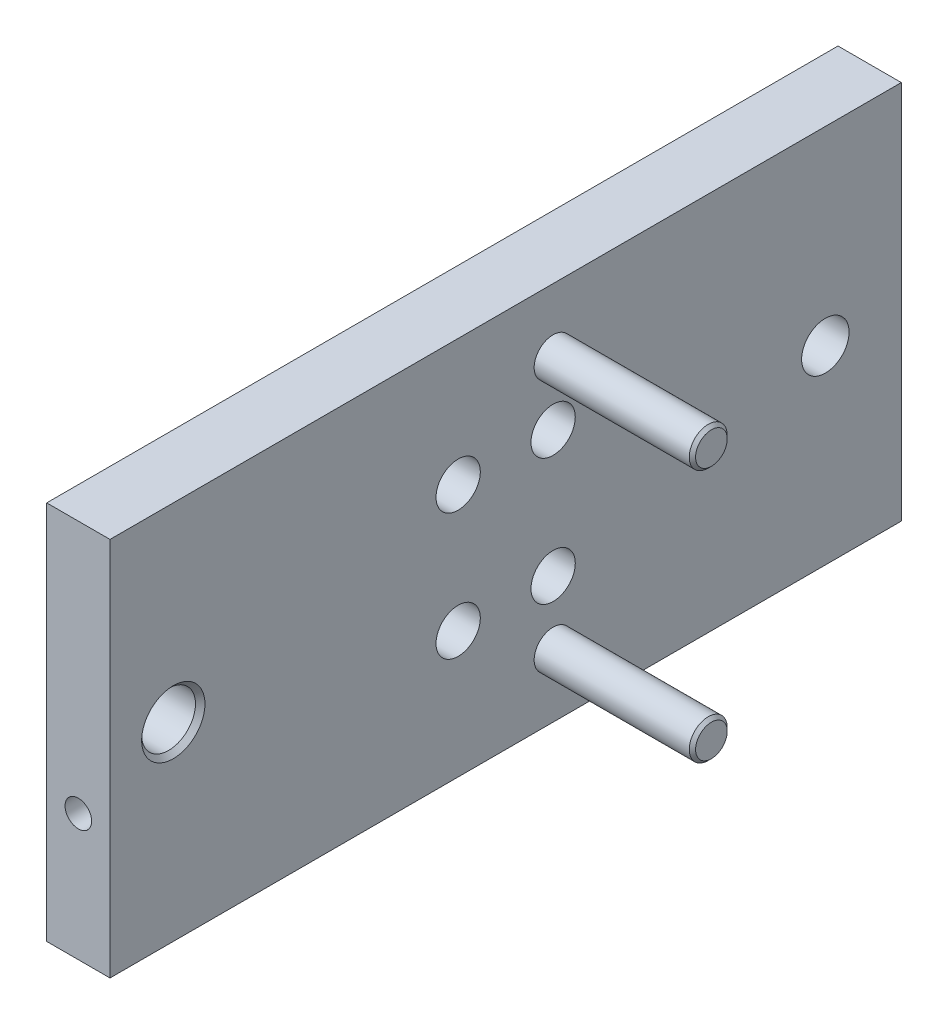
ISO-10303-21;
HEADER;
FILE_DESCRIPTION(('STEP AP214'),'2;1');
FILE_NAME('part.step','',(''),(''),'','','');
FILE_SCHEMA(('AUTOMOTIVE_DESIGN { 1 0 10303 214 1 1 1 1 }'));
ENDSEC;
DATA;
#1=APPLICATION_CONTEXT('core data for automotive mechanical design processes');
#2=APPLICATION_PROTOCOL_DEFINITION('international standard','automotive_design',2000,#1);
#3=PRODUCT_CONTEXT('',#1,'mechanical');
#4=PRODUCT('Part','Part','',(#3));
#5=PRODUCT_RELATED_PRODUCT_CATEGORY('part','',(#4));
#6=PRODUCT_DEFINITION_FORMATION('','',#4);
#7=PRODUCT_DEFINITION_CONTEXT('part definition',#1,'design');
#8=PRODUCT_DEFINITION('design','',#6,#7);
#9=PRODUCT_DEFINITION_SHAPE('','',#8);
#10=(LENGTH_UNIT() NAMED_UNIT(*) SI_UNIT(.MILLI.,.METRE.));
#11=(NAMED_UNIT(*) PLANE_ANGLE_UNIT() SI_UNIT($,.RADIAN.));
#12=(NAMED_UNIT(*) SI_UNIT($,.STERADIAN.) SOLID_ANGLE_UNIT());
#13=UNCERTAINTY_MEASURE_WITH_UNIT(LENGTH_MEASURE(1.E-05),#10,'distance_accuracy_value','');
#14=(GEOMETRIC_REPRESENTATION_CONTEXT(3) GLOBAL_UNCERTAINTY_ASSIGNED_CONTEXT((#13)) GLOBAL_UNIT_ASSIGNED_CONTEXT((#10,
#11,#12)) REPRESENTATION_CONTEXT('',''));
#15=CARTESIAN_POINT('',(0.,0.,0.));
#16=DIRECTION('',(0.,0.,1.));
#17=DIRECTION('',(1.,0.,0.));
#18=AXIS2_PLACEMENT_3D('',#15,#16,#17);
#19=CARTESIAN_POINT('',(10.,60.,0.));
#20=DIRECTION('',(1.,0.,0.));
#21=DIRECTION('',(0.,0.,-1.));
#22=AXIS2_PLACEMENT_3D('',#19,#20,#21);
#23=PLANE('',#22);
#24=CARTESIAN_POINT('',(10.,20.,70.));
#25=DIRECTION('',(1.,0.,0.));
#26=DIRECTION('',(0.,0.,-1.));
#27=AXIS2_PLACEMENT_3D('',#24,#25,#26);
#28=CIRCLE('',#27,3.5);
#29=CARTESIAN_POINT('',(10.,20.,66.5));
#30=VERTEX_POINT('',#29);
#31=EDGE_CURVE('E99',#30,#30,#28,.T.);
#32=ORIENTED_EDGE('',*,*,#31,.F.);
#33=EDGE_LOOP('',(#32));
#34=FACE_BOUND('',#33,.T.);
#35=CARTESIAN_POINT('',(10.,20.,55.));
#36=DIRECTION('',(1.,0.,0.));
#37=DIRECTION('',(0.,0.,-1.));
#38=AXIS2_PLACEMENT_3D('',#35,#36,#37);
#39=CIRCLE('',#38,3.5);
#40=CARTESIAN_POINT('',(10.,20.,51.5));
#41=VERTEX_POINT('',#40);
#42=EDGE_CURVE('E116',#41,#41,#39,.T.);
#43=ORIENTED_EDGE('',*,*,#42,.F.);
#44=EDGE_LOOP('',(#43));
#45=FACE_BOUND('',#44,.T.);
#46=CARTESIAN_POINT('',(10.,40.,55.));
#47=DIRECTION('',(1.,0.,0.));
#48=DIRECTION('',(0.,0.,-1.));
#49=AXIS2_PLACEMENT_3D('',#46,#47,#48);
#50=CIRCLE('',#49,3.5);
#51=CARTESIAN_POINT('',(10.,40.,51.5));
#52=VERTEX_POINT('',#51);
#53=EDGE_CURVE('E128',#52,#52,#50,.T.);
#54=ORIENTED_EDGE('',*,*,#53,.F.);
#55=EDGE_LOOP('',(#54));
#56=FACE_BOUND('',#55,.T.);
#57=CARTESIAN_POINT('',(10.,40.,70.));
#58=DIRECTION('',(1.,0.,0.));
#59=DIRECTION('',(0.,0.,-1.));
#60=AXIS2_PLACEMENT_3D('',#57,#58,#59);
#61=CIRCLE('',#60,3.5);
#62=CARTESIAN_POINT('',(10.,40.,66.5));
#63=VERTEX_POINT('',#62);
#64=EDGE_CURVE('E140',#63,#63,#61,.T.);
#65=ORIENTED_EDGE('',*,*,#64,.F.);
#66=EDGE_LOOP('',(#65));
#67=FACE_BOUND('',#66,.T.);
#68=CARTESIAN_POINT('',(10.,30.,12.));
#69=DIRECTION('',(1.,0.,0.));
#70=DIRECTION('',(0.,0.,-1.));
#71=AXIS2_PLACEMENT_3D('',#68,#69,#70);
#72=CIRCLE('',#71,3.75);
#73=CARTESIAN_POINT('',(10.,30.,8.25));
#74=VERTEX_POINT('',#73);
#75=EDGE_CURVE('E152',#74,#74,#72,.T.);
#76=ORIENTED_EDGE('',*,*,#75,.F.);
#77=EDGE_LOOP('',(#76));
#78=FACE_BOUND('',#77,.T.);
#79=CARTESIAN_POINT('',(10.,30.,115.));
#80=DIRECTION('',(1.,0.,0.));
#81=DIRECTION('',(0.,0.,-1.));
#82=AXIS2_PLACEMENT_3D('',#79,#80,#81);
#83=CIRCLE('',#82,5.);
#84=CARTESIAN_POINT('',(10.,30.,110.));
#85=VERTEX_POINT('',#84);
#86=EDGE_CURVE('E156',#85,#85,#83,.T.);
#87=ORIENTED_EDGE('',*,*,#86,.F.);
#88=EDGE_LOOP('',(#87));
#89=FACE_BOUND('',#88,.T.);
#90=CARTESIAN_POINT('',(10.,9.99999999999999,55.));
#91=DIRECTION('',(1.,0.,0.));
#92=DIRECTION('',(0.,0.,-1.));
#93=AXIS2_PLACEMENT_3D('',#90,#91,#92);
#94=CIRCLE('',#93,3.);
#95=CARTESIAN_POINT('',(10.,9.99999999999999,52.));
#96=VERTEX_POINT('',#95);
#97=EDGE_CURVE('E168',#96,#96,#94,.T.);
#98=ORIENTED_EDGE('',*,*,#97,.F.);
#99=EDGE_LOOP('',(#98));
#100=FACE_BOUND('',#99,.T.);
#101=DIRECTION('',(0.,1.,0.));
#102=VECTOR('',#101,1.);
#103=CARTESIAN_POINT('',(10.,0.,0.));
#104=LINE('',#103,#102);
#105=CARTESIAN_POINT('',(10.,0.,0.));
#106=VERTEX_POINT('',#105);
#107=CARTESIAN_POINT('',(10.,60.,0.));
#108=VERTEX_POINT('',#107);
#109=EDGE_CURVE('E172',#106,#108,#104,.T.);
#110=ORIENTED_EDGE('',*,*,#109,.T.);
#111=DIRECTION('',(0.,0.,1.));
#112=VECTOR('',#111,1.);
#113=CARTESIAN_POINT('',(10.,60.,0.));
#114=LINE('',#113,#112);
#115=CARTESIAN_POINT('',(10.,60.,125.));
#116=VERTEX_POINT('',#115);
#117=EDGE_CURVE('E85',#108,#116,#114,.T.);
#118=ORIENTED_EDGE('',*,*,#117,.T.);
#119=DIRECTION('',(0.,-1.,0.));
#120=VECTOR('',#119,1.);
#121=CARTESIAN_POINT('',(10.,0.,125.));
#122=LINE('',#121,#120);
#123=CARTESIAN_POINT('',(10.,0.,125.));
#124=VERTEX_POINT('',#123);
#125=EDGE_CURVE('E175',#116,#124,#122,.T.);
#126=ORIENTED_EDGE('',*,*,#125,.T.);
#127=DIRECTION('',(0.,0.,-1.));
#128=VECTOR('',#127,1.);
#129=CARTESIAN_POINT('',(10.,0.,0.));
#130=LINE('',#129,#128);
#131=EDGE_CURVE('E53',#124,#106,#130,.T.);
#132=ORIENTED_EDGE('',*,*,#131,.T.);
#133=EDGE_LOOP('',(#110,#118,#126,#132));
#134=FACE_BOUND('',#133,.T.);
#135=CARTESIAN_POINT('',(10.,50.,55.));
#136=DIRECTION('',(1.,0.,0.));
#137=DIRECTION('',(0.,0.,-1.));
#138=AXIS2_PLACEMENT_3D('',#135,#136,#137);
#139=CIRCLE('',#138,3.);
#140=CARTESIAN_POINT('',(10.,50.,52.));
#141=VERTEX_POINT('',#140);
#142=EDGE_CURVE('E165',#141,#141,#139,.T.);
#143=ORIENTED_EDGE('',*,*,#142,.F.);
#144=EDGE_LOOP('',(#143));
#145=FACE_BOUND('',#144,.T.);
#146=ADVANCED_FACE('F36',(#34,#45,#56,#67,#78,#89,#100,#134,#145),#23,.T.);
#147=CARTESIAN_POINT('',(10.,0.,0.));
#148=DIRECTION('',(0.,0.,1.));
#149=DIRECTION('',(1.,0.,0.));
#150=AXIS2_PLACEMENT_3D('',#147,#148,#149);
#151=PLANE('',#150);
#152=DIRECTION('',(0.,1.,0.));
#153=VECTOR('',#152,1.);
#154=CARTESIAN_POINT('',(0.,0.,0.));
#155=LINE('',#154,#153);
#156=CARTESIAN_POINT('',(0.,0.,0.));
#157=VERTEX_POINT('',#156);
#158=CARTESIAN_POINT('',(0.,60.,0.));
#159=VERTEX_POINT('',#158);
#160=EDGE_CURVE('E171',#157,#159,#155,.T.);
#161=ORIENTED_EDGE('',*,*,#160,.T.);
#162=DIRECTION('',(-1.,0.,0.));
#163=VECTOR('',#162,1.);
#164=CARTESIAN_POINT('',(10.,60.,0.));
#165=LINE('',#164,#163);
#166=EDGE_CURVE('E190',#108,#159,#165,.T.);
#167=ORIENTED_EDGE('',*,*,#166,.F.);
#168=ORIENTED_EDGE('',*,*,#109,.F.);
#169=DIRECTION('',(-1.,0.,0.));
#170=VECTOR('',#169,1.);
#171=CARTESIAN_POINT('',(10.,0.,0.));
#172=LINE('',#171,#170);
#173=EDGE_CURVE('E178',#106,#157,#172,.T.);
#174=ORIENTED_EDGE('',*,*,#173,.T.);
#175=EDGE_LOOP('',(#161,#167,#168,#174));
#176=FACE_BOUND('',#175,.T.);
#177=ADVANCED_FACE('F213',(#176),#151,.F.);
#178=CARTESIAN_POINT('',(10.,60.,0.));
#179=DIRECTION('',(0.,-1.,0.));
#180=DIRECTION('',(0.,0.,-1.));
#181=AXIS2_PLACEMENT_3D('',#178,#179,#180);
#182=PLANE('',#181);
#183=DIRECTION('',(0.,0.,1.));
#184=VECTOR('',#183,1.);
#185=CARTESIAN_POINT('',(0.,60.,0.));
#186=LINE('',#185,#184);
#187=CARTESIAN_POINT('',(0.,60.,125.));
#188=VERTEX_POINT('',#187);
#189=EDGE_CURVE('E181',#159,#188,#186,.T.);
#190=ORIENTED_EDGE('',*,*,#189,.T.);
#191=DIRECTION('',(-1.,0.,0.));
#192=VECTOR('',#191,1.);
#193=CARTESIAN_POINT('',(10.,60.,125.));
#194=LINE('',#193,#192);
#195=EDGE_CURVE('E188',#116,#188,#194,.T.);
#196=ORIENTED_EDGE('',*,*,#195,.F.);
#197=ORIENTED_EDGE('',*,*,#117,.F.);
#198=ORIENTED_EDGE('',*,*,#166,.T.);
#199=EDGE_LOOP('',(#190,#196,#197,#198));
#200=FACE_BOUND('',#199,.T.);
#201=ADVANCED_FACE('F219',(#200),#182,.F.);
#202=CARTESIAN_POINT('',(10.,0.,125.));
#203=DIRECTION('',(0.,0.,-1.));
#204=DIRECTION('',(-1.,0.,0.));
#205=AXIS2_PLACEMENT_3D('',#202,#203,#204);
#206=PLANE('',#205);
#207=CARTESIAN_POINT('',(5.,20.,125.));
#208=DIRECTION('',(0.,0.,1.));
#209=DIRECTION('',(1.,0.,0.));
#210=AXIS2_PLACEMENT_3D('',#207,#208,#209);
#211=CIRCLE('',#210,2.09999999999999);
#212=CARTESIAN_POINT('',(7.09999999999999,20.,125.));
#213=VERTEX_POINT('',#212);
#214=EDGE_CURVE('E100',#213,#213,#211,.T.);
#215=ORIENTED_EDGE('',*,*,#214,.F.);
#216=EDGE_LOOP('',(#215));
#217=FACE_BOUND('',#216,.T.);
#218=DIRECTION('',(0.,-1.,0.));
#219=VECTOR('',#218,1.);
#220=CARTESIAN_POINT('',(0.,0.,125.));
#221=LINE('',#220,#219);
#222=CARTESIAN_POINT('',(0.,0.,125.));
#223=VERTEX_POINT('',#222);
#224=EDGE_CURVE('E71',#188,#223,#221,.T.);
#225=ORIENTED_EDGE('',*,*,#224,.T.);
#226=DIRECTION('',(-1.,0.,0.));
#227=VECTOR('',#226,1.);
#228=CARTESIAN_POINT('',(10.,0.,125.));
#229=LINE('',#228,#227);
#230=EDGE_CURVE('E186',#124,#223,#229,.T.);
#231=ORIENTED_EDGE('',*,*,#230,.F.);
#232=ORIENTED_EDGE('',*,*,#125,.F.);
#233=ORIENTED_EDGE('',*,*,#195,.T.);
#234=EDGE_LOOP('',(#225,#231,#232,#233));
#235=FACE_BOUND('',#234,.T.);
#236=ADVANCED_FACE('F235',(#217,#235),#206,.F.);
#237=CARTESIAN_POINT('',(10.,0.,0.));
#238=DIRECTION('',(0.,1.,0.));
#239=DIRECTION('',(0.,0.,1.));
#240=AXIS2_PLACEMENT_3D('',#237,#238,#239);
#241=PLANE('',#240);
#242=DIRECTION('',(0.,0.,-1.));
#243=VECTOR('',#242,1.);
#244=CARTESIAN_POINT('',(0.,0.,0.));
#245=LINE('',#244,#243);
#246=EDGE_CURVE('E77',#223,#157,#245,.T.);
#247=ORIENTED_EDGE('',*,*,#246,.T.);
#248=ORIENTED_EDGE('',*,*,#173,.F.);
#249=ORIENTED_EDGE('',*,*,#131,.F.);
#250=ORIENTED_EDGE('',*,*,#230,.T.);
#251=EDGE_LOOP('',(#247,#248,#249,#250));
#252=FACE_BOUND('',#251,.T.);
#253=ADVANCED_FACE('F231',(#252),#241,.F.);
#254=CARTESIAN_POINT('',(0.,60.,0.));
#255=DIRECTION('',(1.,0.,0.));
#256=DIRECTION('',(0.,0.,-1.));
#257=AXIS2_PLACEMENT_3D('',#254,#255,#256);
#258=PLANE('',#257);
#259=CARTESIAN_POINT('',(0.,20.,70.));
#260=DIRECTION('',(1.,0.,0.));
#261=DIRECTION('',(0.,0.,-1.));
#262=AXIS2_PLACEMENT_3D('',#259,#260,#261);
#263=CIRCLE('',#262,1.7);
#264=CARTESIAN_POINT('',(0.,20.,68.3));
#265=VERTEX_POINT('',#264);
#266=EDGE_CURVE('E113',#265,#265,#263,.T.);
#267=ORIENTED_EDGE('',*,*,#266,.T.);
#268=EDGE_LOOP('',(#267));
#269=FACE_BOUND('',#268,.T.);
#270=CARTESIAN_POINT('',(0.,20.,55.));
#271=DIRECTION('',(1.,0.,0.));
#272=DIRECTION('',(0.,0.,-1.));
#273=AXIS2_PLACEMENT_3D('',#270,#271,#272);
#274=CIRCLE('',#273,1.7);
#275=CARTESIAN_POINT('',(0.,20.,53.3));
#276=VERTEX_POINT('',#275);
#277=EDGE_CURVE('E125',#276,#276,#274,.T.);
#278=ORIENTED_EDGE('',*,*,#277,.T.);
#279=EDGE_LOOP('',(#278));
#280=FACE_BOUND('',#279,.T.);
#281=CARTESIAN_POINT('',(0.,40.,55.));
#282=DIRECTION('',(1.,0.,0.));
#283=DIRECTION('',(0.,0.,-1.));
#284=AXIS2_PLACEMENT_3D('',#281,#282,#283);
#285=CIRCLE('',#284,1.7);
#286=CARTESIAN_POINT('',(0.,40.,53.3));
#287=VERTEX_POINT('',#286);
#288=EDGE_CURVE('E137',#287,#287,#285,.T.);
#289=ORIENTED_EDGE('',*,*,#288,.T.);
#290=EDGE_LOOP('',(#289));
#291=FACE_BOUND('',#290,.T.);
#292=CARTESIAN_POINT('',(0.,40.,70.));
#293=DIRECTION('',(1.,0.,0.));
#294=DIRECTION('',(0.,0.,-1.));
#295=AXIS2_PLACEMENT_3D('',#292,#293,#294);
#296=CIRCLE('',#295,1.7);
#297=CARTESIAN_POINT('',(0.,40.,68.3));
#298=VERTEX_POINT('',#297);
#299=EDGE_CURVE('E149',#298,#298,#296,.T.);
#300=ORIENTED_EDGE('',*,*,#299,.T.);
#301=EDGE_LOOP('',(#300));
#302=FACE_BOUND('',#301,.T.);
#303=CARTESIAN_POINT('',(0.,30.,12.));
#304=DIRECTION('',(1.,0.,0.));
#305=DIRECTION('',(0.,0.,-1.));
#306=AXIS2_PLACEMENT_3D('',#303,#304,#305);
#307=CIRCLE('',#306,3.75);
#308=CARTESIAN_POINT('',(0.,30.,8.25));
#309=VERTEX_POINT('',#308);
#310=EDGE_CURVE('E153',#309,#309,#307,.T.);
#311=ORIENTED_EDGE('',*,*,#310,.T.);
#312=EDGE_LOOP('',(#311));
#313=FACE_BOUND('',#312,.T.);
#314=CARTESIAN_POINT('',(0.,30.,115.));
#315=DIRECTION('',(1.,0.,0.));
#316=DIRECTION('',(0.,0.,-1.));
#317=AXIS2_PLACEMENT_3D('',#314,#315,#316);
#318=CIRCLE('',#317,4.24999999999999);
#319=CARTESIAN_POINT('',(0.,30.,110.75));
#320=VERTEX_POINT('',#319);
#321=EDGE_CURVE('E164',#320,#320,#318,.T.);
#322=ORIENTED_EDGE('',*,*,#321,.T.);
#323=EDGE_LOOP('',(#322));
#324=FACE_BOUND('',#323,.T.);
#325=ORIENTED_EDGE('',*,*,#160,.F.);
#326=ORIENTED_EDGE('',*,*,#246,.F.);
#327=ORIENTED_EDGE('',*,*,#224,.F.);
#328=ORIENTED_EDGE('',*,*,#189,.F.);
#329=EDGE_LOOP('',(#325,#326,#327,#328));
#330=FACE_BOUND('',#329,.T.);
#331=ADVANCED_FACE('F228',(#269,#280,#291,#302,#313,#324,#330),#258,.F.);
#332=CARTESIAN_POINT('',(35.,9.99999999999999,55.));
#333=DIRECTION('',(-1.,0.,0.));
#334=DIRECTION('',(0.,0.,1.));
#335=AXIS2_PLACEMENT_3D('',#332,#333,#334);
#336=CYLINDRICAL_SURFACE('',#335,3.);
#337=CARTESIAN_POINT('',(34.5,9.99999999999999,55.));
#338=DIRECTION('',(1.,0.,0.));
#339=DIRECTION('',(0.,0.,-1.));
#340=AXIS2_PLACEMENT_3D('',#337,#338,#339);
#341=CIRCLE('',#340,3.);
#342=CARTESIAN_POINT('',(34.5,9.99999999999999,52.));
#343=VERTEX_POINT('',#342);
#344=EDGE_CURVE('E11',#343,#343,#341,.F.);
#345=ORIENTED_EDGE('',*,*,#344,.T.);
#346=EDGE_LOOP('',(#345));
#347=FACE_BOUND('',#346,.T.);
#348=ORIENTED_EDGE('',*,*,#97,.T.);
#349=EDGE_LOOP('',(#348));
#350=FACE_BOUND('',#349,.T.);
#351=ADVANCED_FACE('F226',(#347,#350),#336,.T.);
#352=CARTESIAN_POINT('',(35.,9.99999999999999,55.));
#353=DIRECTION('',(1.,0.,0.));
#354=DIRECTION('',(0.,0.,-1.));
#355=AXIS2_PLACEMENT_3D('',#352,#353,#354);
#356=PLANE('',#355);
#357=CARTESIAN_POINT('',(35.,9.99999999999999,55.));
#358=DIRECTION('',(1.,0.,0.));
#359=DIRECTION('',(0.,0.,-1.));
#360=AXIS2_PLACEMENT_3D('',#357,#358,#359);
#361=CIRCLE('',#360,2.50000000000002);
#362=CARTESIAN_POINT('',(35.,9.99999999999999,52.5));
#363=VERTEX_POINT('',#362);
#364=EDGE_CURVE('E45',#363,#363,#361,.T.);
#365=ORIENTED_EDGE('',*,*,#364,.T.);
#366=EDGE_LOOP('',(#365));
#367=FACE_BOUND('',#366,.T.);
#368=ADVANCED_FACE('F202',(#367),#356,.T.);
#369=CARTESIAN_POINT('',(35.,50.,55.));
#370=DIRECTION('',(-1.,0.,0.));
#371=DIRECTION('',(0.,0.,1.));
#372=AXIS2_PLACEMENT_3D('',#369,#370,#371);
#373=CYLINDRICAL_SURFACE('',#372,3.);
#374=CARTESIAN_POINT('',(34.5,50.,55.));
#375=DIRECTION('',(1.,0.,0.));
#376=DIRECTION('',(0.,0.,-1.));
#377=AXIS2_PLACEMENT_3D('',#374,#375,#376);
#378=CIRCLE('',#377,3.);
#379=CARTESIAN_POINT('',(34.5,50.,52.));
#380=VERTEX_POINT('',#379);
#381=EDGE_CURVE('E197',#380,#380,#378,.F.);
#382=ORIENTED_EDGE('',*,*,#381,.T.);
#383=EDGE_LOOP('',(#382));
#384=FACE_BOUND('',#383,.T.);
#385=ORIENTED_EDGE('',*,*,#142,.T.);
#386=EDGE_LOOP('',(#385));
#387=FACE_BOUND('',#386,.T.);
#388=ADVANCED_FACE('F250',(#384,#387),#373,.T.);
#389=CARTESIAN_POINT('',(35.,50.,55.));
#390=DIRECTION('',(1.,0.,0.));
#391=DIRECTION('',(0.,0.,-1.));
#392=AXIS2_PLACEMENT_3D('',#389,#390,#391);
#393=PLANE('',#392);
#394=CARTESIAN_POINT('',(35.,50.,55.));
#395=DIRECTION('',(1.,0.,0.));
#396=DIRECTION('',(0.,0.,-1.));
#397=AXIS2_PLACEMENT_3D('',#394,#395,#396);
#398=CIRCLE('',#397,2.50000000000002);
#399=CARTESIAN_POINT('',(35.,50.,52.5));
#400=VERTEX_POINT('',#399);
#401=EDGE_CURVE('E192',#400,#400,#398,.T.);
#402=ORIENTED_EDGE('',*,*,#401,.T.);
#403=EDGE_LOOP('',(#402));
#404=FACE_BOUND('',#403,.T.);
#405=ADVANCED_FACE('F252',(#404),#393,.T.);
#406=CARTESIAN_POINT('',(10.,30.,115.));
#407=DIRECTION('',(1.,0.,0.));
#408=DIRECTION('',(0.,0.,-1.));
#409=AXIS2_PLACEMENT_3D('',#406,#407,#408);
#410=CYLINDRICAL_SURFACE('',#409,4.24999999999999);
#411=CARTESIAN_POINT('',(9.25,30.,115.));
#412=DIRECTION('',(1.,0.,0.));
#413=DIRECTION('',(0.,0.,-1.));
#414=AXIS2_PLACEMENT_3D('',#411,#412,#413);
#415=CIRCLE('',#414,4.25);
#416=CARTESIAN_POINT('',(9.25,30.,110.75));
#417=VERTEX_POINT('',#416);
#418=EDGE_CURVE('E161',#417,#417,#415,.T.);
#419=ORIENTED_EDGE('',*,*,#418,.T.);
#420=EDGE_LOOP('',(#419));
#421=FACE_BOUND('',#420,.T.);
#422=ORIENTED_EDGE('',*,*,#321,.F.);
#423=EDGE_LOOP('',(#422));
#424=FACE_BOUND('',#423,.T.);
#425=ADVANCED_FACE('F259',(#421,#424),#410,.F.);
#426=CARTESIAN_POINT('',(10.,30.,115.));
#427=DIRECTION('',(1.,0.,0.));
#428=DIRECTION('',(0.,0.,-1.));
#429=AXIS2_PLACEMENT_3D('',#426,#427,#428);
#430=CONICAL_SURFACE('',#429,5.,0.785398163397448);
#431=ORIENTED_EDGE('',*,*,#418,.F.);
#432=EDGE_LOOP('',(#431));
#433=FACE_BOUND('',#432,.T.);
#434=ORIENTED_EDGE('',*,*,#86,.T.);
#435=EDGE_LOOP('',(#434));
#436=FACE_BOUND('',#435,.T.);
#437=ADVANCED_FACE('F265',(#433,#436),#430,.F.);
#438=CARTESIAN_POINT('',(0.,30.,12.));
#439=DIRECTION('',(1.,0.,0.));
#440=DIRECTION('',(0.,0.,-1.));
#441=AXIS2_PLACEMENT_3D('',#438,#439,#440);
#442=CYLINDRICAL_SURFACE('',#441,3.75);
#443=ORIENTED_EDGE('',*,*,#310,.F.);
#444=EDGE_LOOP('',(#443));
#445=FACE_BOUND('',#444,.T.);
#446=ORIENTED_EDGE('',*,*,#75,.T.);
#447=EDGE_LOOP('',(#446));
#448=FACE_BOUND('',#447,.T.);
#449=ADVANCED_FACE('F269',(#445,#448),#442,.F.);
#450=CARTESIAN_POINT('',(10.,40.,70.));
#451=DIRECTION('',(1.,0.,0.));
#452=DIRECTION('',(0.,0.,-1.));
#453=AXIS2_PLACEMENT_3D('',#450,#451,#452);
#454=CYLINDRICAL_SURFACE('',#453,1.7);
#455=ORIENTED_EDGE('',*,*,#299,.F.);
#456=EDGE_LOOP('',(#455));
#457=FACE_BOUND('',#456,.T.);
#458=CARTESIAN_POINT('',(5.,40.,70.));
#459=DIRECTION('',(1.,0.,0.));
#460=DIRECTION('',(0.,0.,-1.));
#461=AXIS2_PLACEMENT_3D('',#458,#459,#460);
#462=CIRCLE('',#461,1.7);
#463=CARTESIAN_POINT('',(5.,40.,68.3));
#464=VERTEX_POINT('',#463);
#465=EDGE_CURVE('E146',#464,#464,#462,.T.);
#466=ORIENTED_EDGE('',*,*,#465,.T.);
#467=EDGE_LOOP('',(#466));
#468=FACE_BOUND('',#467,.T.);
#469=ADVANCED_FACE('F273',(#457,#468),#454,.F.);
#470=CARTESIAN_POINT('',(5.,41.7,70.));
#471=DIRECTION('',(-1.,0.,0.));
#472=DIRECTION('',(0.,0.,1.));
#473=AXIS2_PLACEMENT_3D('',#470,#471,#472);
#474=PLANE('',#473);
#475=ORIENTED_EDGE('',*,*,#465,.F.);
#476=EDGE_LOOP('',(#475));
#477=FACE_BOUND('',#476,.T.);
#478=CARTESIAN_POINT('',(5.,40.,70.));
#479=DIRECTION('',(1.,0.,0.));
#480=DIRECTION('',(0.,0.,-1.));
#481=AXIS2_PLACEMENT_3D('',#478,#479,#480);
#482=CIRCLE('',#481,3.5);
#483=CARTESIAN_POINT('',(5.,40.,66.5));
#484=VERTEX_POINT('',#483);
#485=EDGE_CURVE('E143',#484,#484,#482,.T.);
#486=ORIENTED_EDGE('',*,*,#485,.T.);
#487=EDGE_LOOP('',(#486));
#488=FACE_BOUND('',#487,.T.);
#489=ADVANCED_FACE('F277',(#477,#488),#474,.F.);
#490=CARTESIAN_POINT('',(10.,40.,70.));
#491=DIRECTION('',(1.,0.,0.));
#492=DIRECTION('',(0.,0.,-1.));
#493=AXIS2_PLACEMENT_3D('',#490,#491,#492);
#494=CYLINDRICAL_SURFACE('',#493,3.5);
#495=ORIENTED_EDGE('',*,*,#485,.F.);
#496=EDGE_LOOP('',(#495));
#497=FACE_BOUND('',#496,.T.);
#498=ORIENTED_EDGE('',*,*,#64,.T.);
#499=EDGE_LOOP('',(#498));
#500=FACE_BOUND('',#499,.T.);
#501=ADVANCED_FACE('F281',(#497,#500),#494,.F.);
#502=CARTESIAN_POINT('',(10.,40.,55.));
#503=DIRECTION('',(1.,0.,0.));
#504=DIRECTION('',(0.,0.,-1.));
#505=AXIS2_PLACEMENT_3D('',#502,#503,#504);
#506=CYLINDRICAL_SURFACE('',#505,1.7);
#507=ORIENTED_EDGE('',*,*,#288,.F.);
#508=EDGE_LOOP('',(#507));
#509=FACE_BOUND('',#508,.T.);
#510=CARTESIAN_POINT('',(5.,40.,55.));
#511=DIRECTION('',(1.,0.,0.));
#512=DIRECTION('',(0.,0.,-1.));
#513=AXIS2_PLACEMENT_3D('',#510,#511,#512);
#514=CIRCLE('',#513,1.7);
#515=CARTESIAN_POINT('',(5.,40.,53.3));
#516=VERTEX_POINT('',#515);
#517=EDGE_CURVE('E134',#516,#516,#514,.T.);
#518=ORIENTED_EDGE('',*,*,#517,.T.);
#519=EDGE_LOOP('',(#518));
#520=FACE_BOUND('',#519,.T.);
#521=ADVANCED_FACE('F285',(#509,#520),#506,.F.);
#522=CARTESIAN_POINT('',(5.,41.7,55.));
#523=DIRECTION('',(-1.,0.,0.));
#524=DIRECTION('',(0.,0.,1.));
#525=AXIS2_PLACEMENT_3D('',#522,#523,#524);
#526=PLANE('',#525);
#527=ORIENTED_EDGE('',*,*,#517,.F.);
#528=EDGE_LOOP('',(#527));
#529=FACE_BOUND('',#528,.T.);
#530=CARTESIAN_POINT('',(5.,40.,55.));
#531=DIRECTION('',(1.,0.,0.));
#532=DIRECTION('',(0.,0.,-1.));
#533=AXIS2_PLACEMENT_3D('',#530,#531,#532);
#534=CIRCLE('',#533,3.5);
#535=CARTESIAN_POINT('',(5.,40.,51.5));
#536=VERTEX_POINT('',#535);
#537=EDGE_CURVE('E131',#536,#536,#534,.T.);
#538=ORIENTED_EDGE('',*,*,#537,.T.);
#539=EDGE_LOOP('',(#538));
#540=FACE_BOUND('',#539,.T.);
#541=ADVANCED_FACE('F289',(#529,#540),#526,.F.);
#542=CARTESIAN_POINT('',(10.,40.,55.));
#543=DIRECTION('',(1.,0.,0.));
#544=DIRECTION('',(0.,0.,-1.));
#545=AXIS2_PLACEMENT_3D('',#542,#543,#544);
#546=CYLINDRICAL_SURFACE('',#545,3.5);
#547=ORIENTED_EDGE('',*,*,#537,.F.);
#548=EDGE_LOOP('',(#547));
#549=FACE_BOUND('',#548,.T.);
#550=ORIENTED_EDGE('',*,*,#53,.T.);
#551=EDGE_LOOP('',(#550));
#552=FACE_BOUND('',#551,.T.);
#553=ADVANCED_FACE('F293',(#549,#552),#546,.F.);
#554=CARTESIAN_POINT('',(10.,20.,55.));
#555=DIRECTION('',(1.,0.,0.));
#556=DIRECTION('',(0.,0.,-1.));
#557=AXIS2_PLACEMENT_3D('',#554,#555,#556);
#558=CYLINDRICAL_SURFACE('',#557,1.7);
#559=ORIENTED_EDGE('',*,*,#277,.F.);
#560=EDGE_LOOP('',(#559));
#561=FACE_BOUND('',#560,.T.);
#562=CARTESIAN_POINT('',(5.,20.,55.));
#563=DIRECTION('',(1.,0.,0.));
#564=DIRECTION('',(0.,0.,-1.));
#565=AXIS2_PLACEMENT_3D('',#562,#563,#564);
#566=CIRCLE('',#565,1.7);
#567=CARTESIAN_POINT('',(5.,20.,53.3));
#568=VERTEX_POINT('',#567);
#569=EDGE_CURVE('E122',#568,#568,#566,.T.);
#570=ORIENTED_EDGE('',*,*,#569,.T.);
#571=EDGE_LOOP('',(#570));
#572=FACE_BOUND('',#571,.T.);
#573=ADVANCED_FACE('F297',(#561,#572),#558,.F.);
#574=CARTESIAN_POINT('',(5.,21.7,55.));
#575=DIRECTION('',(-1.,0.,0.));
#576=DIRECTION('',(0.,0.,1.));
#577=AXIS2_PLACEMENT_3D('',#574,#575,#576);
#578=PLANE('',#577);
#579=ORIENTED_EDGE('',*,*,#569,.F.);
#580=EDGE_LOOP('',(#579));
#581=FACE_BOUND('',#580,.T.);
#582=CARTESIAN_POINT('',(5.,20.,55.));
#583=DIRECTION('',(1.,0.,0.));
#584=DIRECTION('',(0.,0.,-1.));
#585=AXIS2_PLACEMENT_3D('',#582,#583,#584);
#586=CIRCLE('',#585,3.5);
#587=CARTESIAN_POINT('',(5.,20.,51.5));
#588=VERTEX_POINT('',#587);
#589=EDGE_CURVE('E119',#588,#588,#586,.T.);
#590=ORIENTED_EDGE('',*,*,#589,.T.);
#591=EDGE_LOOP('',(#590));
#592=FACE_BOUND('',#591,.T.);
#593=ADVANCED_FACE('F301',(#581,#592),#578,.F.);
#594=CARTESIAN_POINT('',(10.,20.,55.));
#595=DIRECTION('',(1.,0.,0.));
#596=DIRECTION('',(0.,0.,-1.));
#597=AXIS2_PLACEMENT_3D('',#594,#595,#596);
#598=CYLINDRICAL_SURFACE('',#597,3.5);
#599=ORIENTED_EDGE('',*,*,#589,.F.);
#600=EDGE_LOOP('',(#599));
#601=FACE_BOUND('',#600,.T.);
#602=ORIENTED_EDGE('',*,*,#42,.T.);
#603=EDGE_LOOP('',(#602));
#604=FACE_BOUND('',#603,.T.);
#605=ADVANCED_FACE('F305',(#601,#604),#598,.F.);
#606=CARTESIAN_POINT('',(10.,20.,70.));
#607=DIRECTION('',(1.,0.,0.));
#608=DIRECTION('',(0.,0.,-1.));
#609=AXIS2_PLACEMENT_3D('',#606,#607,#608);
#610=CYLINDRICAL_SURFACE('',#609,1.7);
#611=ORIENTED_EDGE('',*,*,#266,.F.);
#612=EDGE_LOOP('',(#611));
#613=FACE_BOUND('',#612,.T.);
#614=CARTESIAN_POINT('',(5.,20.,70.));
#615=DIRECTION('',(1.,0.,0.));
#616=DIRECTION('',(0.,0.,-1.));
#617=AXIS2_PLACEMENT_3D('',#614,#615,#616);
#618=CIRCLE('',#617,1.7);
#619=CARTESIAN_POINT('',(5.,20.,68.3));
#620=VERTEX_POINT('',#619);
#621=EDGE_CURVE('E110',#620,#620,#618,.T.);
#622=ORIENTED_EDGE('',*,*,#621,.T.);
#623=EDGE_LOOP('',(#622));
#624=FACE_BOUND('',#623,.T.);
#625=ADVANCED_FACE('F309',(#613,#624),#610,.F.);
#626=CARTESIAN_POINT('',(5.,21.7,70.));
#627=DIRECTION('',(-1.,0.,0.));
#628=DIRECTION('',(0.,0.,1.));
#629=AXIS2_PLACEMENT_3D('',#626,#627,#628);
#630=PLANE('',#629);
#631=ORIENTED_EDGE('',*,*,#621,.F.);
#632=EDGE_LOOP('',(#631));
#633=FACE_BOUND('',#632,.T.);
#634=CARTESIAN_POINT('',(5.,20.,70.));
#635=DIRECTION('',(1.,0.,0.));
#636=DIRECTION('',(0.,0.,-1.));
#637=AXIS2_PLACEMENT_3D('',#634,#635,#636);
#638=CIRCLE('',#637,3.5);
#639=CARTESIAN_POINT('',(5.,20.,66.5));
#640=VERTEX_POINT('',#639);
#641=EDGE_CURVE('E103',#640,#640,#638,.T.);
#642=ORIENTED_EDGE('',*,*,#641,.T.);
#643=EDGE_LOOP('',(#642));
#644=FACE_BOUND('',#643,.T.);
#645=ADVANCED_FACE('F313',(#633,#644),#630,.F.);
#646=CARTESIAN_POINT('',(10.,20.,70.));
#647=DIRECTION('',(1.,0.,0.));
#648=DIRECTION('',(0.,0.,-1.));
#649=AXIS2_PLACEMENT_3D('',#646,#647,#648);
#650=CYLINDRICAL_SURFACE('',#649,3.5);
#651=ORIENTED_EDGE('',*,*,#641,.F.);
#652=EDGE_LOOP('',(#651));
#653=FACE_BOUND('',#652,.T.);
#654=ORIENTED_EDGE('',*,*,#31,.T.);
#655=EDGE_LOOP('',(#654));
#656=FACE_BOUND('',#655,.T.);
#657=ADVANCED_FACE('F93',(#653,#656),#650,.F.);
#658=CARTESIAN_POINT('',(5.,20.,112.6));
#659=DIRECTION('',(0.,0.,1.));
#660=DIRECTION('',(1.,0.,0.));
#661=AXIS2_PLACEMENT_3D('',#658,#659,#660);
#662=CONICAL_SURFACE('',#661,2.09999999999999,1.02974425867665);
#663=CARTESIAN_POINT('',(5.,20.,111.338192700042));
#664=VERTEX_POINT('',#663);
#665=VERTEX_LOOP('',#664);
#666=FACE_BOUND('',#665,.T.);
#667=CARTESIAN_POINT('',(5.,20.,112.6));
#668=DIRECTION('',(0.,0.,1.));
#669=DIRECTION('',(1.,0.,0.));
#670=AXIS2_PLACEMENT_3D('',#667,#668,#669);
#671=CIRCLE('',#670,2.09999999999999);
#672=CARTESIAN_POINT('',(7.09999999999999,20.,112.6));
#673=VERTEX_POINT('',#672);
#674=EDGE_CURVE('E97',#673,#673,#671,.T.);
#675=ORIENTED_EDGE('',*,*,#674,.T.);
#676=EDGE_LOOP('',(#675));
#677=FACE_BOUND('',#676,.T.);
#678=ADVANCED_FACE('F89',(#666,#677),#662,.F.);
#679=CARTESIAN_POINT('',(5.,20.,125.));
#680=DIRECTION('',(0.,0.,1.));
#681=DIRECTION('',(1.,0.,0.));
#682=AXIS2_PLACEMENT_3D('',#679,#680,#681);
#683=CYLINDRICAL_SURFACE('',#682,2.09999999999999);
#684=ORIENTED_EDGE('',*,*,#674,.F.);
#685=EDGE_LOOP('',(#684));
#686=FACE_BOUND('',#685,.T.);
#687=ORIENTED_EDGE('',*,*,#214,.T.);
#688=EDGE_LOOP('',(#687));
#689=FACE_BOUND('',#688,.T.);
#690=ADVANCED_FACE('F92',(#686,#689),#683,.F.);
#691=CARTESIAN_POINT('',(35.,50.,55.));
#692=DIRECTION('',(-1.,0.,0.));
#693=DIRECTION('',(0.,0.,1.));
#694=AXIS2_PLACEMENT_3D('',#691,#692,#693);
#695=CONICAL_SURFACE('',#694,2.50000000000002,0.785398163397447);
#696=ORIENTED_EDGE('',*,*,#381,.F.);
#697=EDGE_LOOP('',(#696));
#698=FACE_BOUND('',#697,.T.);
#699=ORIENTED_EDGE('',*,*,#401,.F.);
#700=EDGE_LOOP('',(#699));
#701=FACE_BOUND('',#700,.T.);
#702=ADVANCED_FACE('F205',(#698,#701),#695,.T.);
#703=CARTESIAN_POINT('',(35.,9.99999999999999,55.));
#704=DIRECTION('',(-1.,0.,0.));
#705=DIRECTION('',(0.,0.,1.));
#706=AXIS2_PLACEMENT_3D('',#703,#704,#705);
#707=CONICAL_SURFACE('',#706,2.50000000000002,0.785398163397447);
#708=ORIENTED_EDGE('',*,*,#344,.F.);
#709=EDGE_LOOP('',(#708));
#710=FACE_BOUND('',#709,.T.);
#711=ORIENTED_EDGE('',*,*,#364,.F.);
#712=EDGE_LOOP('',(#711));
#713=FACE_BOUND('',#712,.T.);
#714=ADVANCED_FACE('F38',(#710,#713),#707,.T.);
#715=CLOSED_SHELL('',(#146,#177,#201,#236,#253,#331,#351,#368,#388,#405,#425,#437,#449,#469,
#489,#501,#521,#541,#553,#573,#593,#605,#625,#645,#657,#678,#690,#702,#714));
#716=MANIFOLD_SOLID_BREP('B2',#715);
#717=ADVANCED_BREP_SHAPE_REPRESENTATION('',(#18,#716),#14);
#718=SHAPE_DEFINITION_REPRESENTATION(#9,#717);
ENDSEC;
END-ISO-10303-21;
